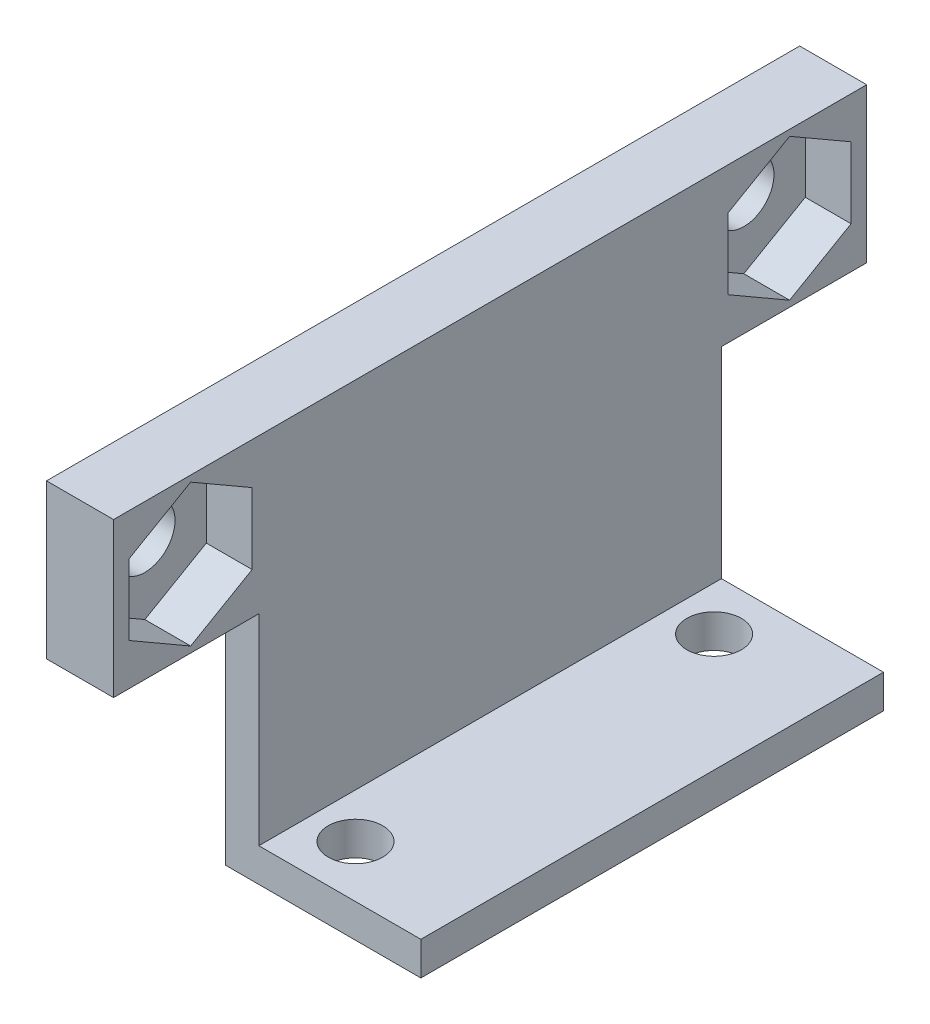
ISO-10303-21;
HEADER;
FILE_DESCRIPTION(('STEP AP214'),'2;1');
FILE_NAME('part.step','',(''),(''),'','','');
FILE_SCHEMA(('AUTOMOTIVE_DESIGN { 1 0 10303 214 1 1 1 1 }'));
ENDSEC;
DATA;
#1=APPLICATION_CONTEXT('core data for automotive mechanical design processes');
#2=APPLICATION_PROTOCOL_DEFINITION('international standard','automotive_design',2000,#1);
#3=PRODUCT_CONTEXT('',#1,'mechanical');
#4=PRODUCT('Part','Part','',(#3));
#5=PRODUCT_RELATED_PRODUCT_CATEGORY('part','',(#4));
#6=PRODUCT_DEFINITION_FORMATION('','',#4);
#7=PRODUCT_DEFINITION_CONTEXT('part definition',#1,'design');
#8=PRODUCT_DEFINITION('design','',#6,#7);
#9=PRODUCT_DEFINITION_SHAPE('','',#8);
#10=(LENGTH_UNIT() NAMED_UNIT(*) SI_UNIT(.MILLI.,.METRE.));
#11=(NAMED_UNIT(*) PLANE_ANGLE_UNIT() SI_UNIT($,.RADIAN.));
#12=(NAMED_UNIT(*) SI_UNIT($,.STERADIAN.) SOLID_ANGLE_UNIT());
#13=UNCERTAINTY_MEASURE_WITH_UNIT(LENGTH_MEASURE(1.E-05),#10,'distance_accuracy_value','');
#14=(GEOMETRIC_REPRESENTATION_CONTEXT(3) GLOBAL_UNCERTAINTY_ASSIGNED_CONTEXT((#13)) GLOBAL_UNIT_ASSIGNED_CONTEXT((#10,
#11,#12)) REPRESENTATION_CONTEXT('',''));
#15=CARTESIAN_POINT('',(0.,0.,0.));
#16=DIRECTION('',(0.,0.,1.));
#17=DIRECTION('',(1.,0.,0.));
#18=AXIS2_PLACEMENT_3D('',#15,#16,#17);
#19=CARTESIAN_POINT('',(0.,0.,0.));
#20=DIRECTION('',(1.,0.,0.));
#21=DIRECTION('',(0.,0.,-1.));
#22=AXIS2_PLACEMENT_3D('',#19,#20,#21);
#23=PLANE('',#22);
#24=DIRECTION('',(0.,-0.5,-0.866025403784439));
#25=VECTOR('',#24,1.);
#26=CARTESIAN_POINT('',(0.,17.1156254174884,3.05));
#27=LINE('',#26,#25);
#28=CARTESIAN_POINT('',(0.,17.1156254174884,3.05));
#29=VERTEX_POINT('',#28);
#30=CARTESIAN_POINT('',(0.,15.5279121772169,0.299999999999996));
#31=VERTEX_POINT('',#30);
#32=EDGE_CURVE('E284',#29,#31,#27,.T.);
#33=ORIENTED_EDGE('',*,*,#32,.T.);
#34=DIRECTION('',(0.,-1.,0.));
#35=VECTOR('',#34,1.);
#36=CARTESIAN_POINT('',(0.,15.5279121772169,0.299999999999996));
#37=LINE('',#36,#35);
#38=CARTESIAN_POINT('',(0.,12.352485696674,0.299999999999996));
#39=VERTEX_POINT('',#38);
#40=EDGE_CURVE('E67',#31,#39,#37,.T.);
#41=ORIENTED_EDGE('',*,*,#40,.T.);
#42=DIRECTION('',(0.,-0.5,0.866025403784438));
#43=VECTOR('',#42,1.);
#44=CARTESIAN_POINT('',(0.,12.352485696674,0.299999999999996));
#45=LINE('',#44,#43);
#46=CARTESIAN_POINT('',(0.,10.7647724564025,3.05));
#47=VERTEX_POINT('',#46);
#48=EDGE_CURVE('E268',#39,#47,#45,.T.);
#49=ORIENTED_EDGE('',*,*,#48,.T.);
#50=DIRECTION('',(0.,0.5,0.866025403784439));
#51=VECTOR('',#50,1.);
#52=CARTESIAN_POINT('',(0.,10.7647724564025,3.05));
#53=LINE('',#52,#51);
#54=CARTESIAN_POINT('',(0.,12.352485696674,5.8));
#55=VERTEX_POINT('',#54);
#56=EDGE_CURVE('E272',#47,#55,#53,.T.);
#57=ORIENTED_EDGE('',*,*,#56,.T.);
#58=DIRECTION('',(0.,1.,0.));
#59=VECTOR('',#58,1.);
#60=CARTESIAN_POINT('',(0.,12.352485696674,5.8));
#61=LINE('',#60,#59);
#62=CARTESIAN_POINT('',(0.,15.5279121772169,5.8));
#63=VERTEX_POINT('',#62);
#64=EDGE_CURVE('E276',#55,#63,#61,.T.);
#65=ORIENTED_EDGE('',*,*,#64,.T.);
#66=DIRECTION('',(0.,0.5,-0.866025403784438));
#67=VECTOR('',#66,1.);
#68=CARTESIAN_POINT('',(0.,15.5279121772169,5.8));
#69=LINE('',#68,#67);
#70=EDGE_CURVE('E280',#63,#29,#69,.T.);
#71=ORIENTED_EDGE('',*,*,#70,.T.);
#72=EDGE_LOOP('',(#33,#41,#49,#57,#65,#71));
#73=FACE_BOUND('',#72,.T.);
#74=DIRECTION('',(0.,0.,-1.));
#75=VECTOR('',#74,1.);
#76=CARTESIAN_POINT('',(0.,10.4901989369455,6.5));
#77=LINE('',#76,#75);
#78=CARTESIAN_POINT('',(0.,10.4901989369455,6.5));
#79=VERTEX_POINT('',#78);
#80=CARTESIAN_POINT('',(0.,10.4901989369455,0.));
#81=VERTEX_POINT('',#80);
#82=EDGE_CURVE('E352',#79,#81,#77,.T.);
#83=ORIENTED_EDGE('',*,*,#82,.T.);
#84=DIRECTION('',(0.,1.,0.));
#85=VECTOR('',#84,1.);
#86=CARTESIAN_POINT('',(0.,0.,0.));
#87=LINE('',#86,#85);
#88=CARTESIAN_POINT('',(0.,1.5,0.));
#89=VERTEX_POINT('',#88);
#90=EDGE_CURVE('E386',#89,#81,#87,.T.);
#91=ORIENTED_EDGE('',*,*,#90,.F.);
#92=DIRECTION('',(0.,0.,1.));
#93=VECTOR('',#92,1.);
#94=CARTESIAN_POINT('',(0.,1.5,0.));
#95=LINE('',#94,#93);
#96=CARTESIAN_POINT('',(0.,1.5,-20.7));
#97=VERTEX_POINT('',#96);
#98=EDGE_CURVE('E427',#97,#89,#95,.T.);
#99=ORIENTED_EDGE('',*,*,#98,.F.);
#100=DIRECTION('',(0.,-1.,0.));
#101=VECTOR('',#100,1.);
#102=CARTESIAN_POINT('',(0.,0.,-20.7));
#103=LINE('',#102,#101);
#104=CARTESIAN_POINT('',(0.,10.4901989369455,-20.7));
#105=VERTEX_POINT('',#104);
#106=EDGE_CURVE('E381',#105,#97,#103,.T.);
#107=ORIENTED_EDGE('',*,*,#106,.F.);
#108=CARTESIAN_POINT('',(0.,10.4901989369455,-27.2));
#109=VERTEX_POINT('',#108);
#110=EDGE_CURVE('E351',#105,#109,#77,.T.);
#111=ORIENTED_EDGE('',*,*,#110,.T.);
#112=DIRECTION('',(0.,1.,0.));
#113=VECTOR('',#112,1.);
#114=CARTESIAN_POINT('',(0.,17.3901989369455,-27.2));
#115=LINE('',#114,#113);
#116=CARTESIAN_POINT('',(0.,17.3901989369455,-27.2));
#117=VERTEX_POINT('',#116);
#118=EDGE_CURVE('E356',#109,#117,#115,.T.);
#119=ORIENTED_EDGE('',*,*,#118,.T.);
#120=DIRECTION('',(0.,0.,1.));
#121=VECTOR('',#120,1.);
#122=CARTESIAN_POINT('',(0.,17.3901989369455,6.5));
#123=LINE('',#122,#121);
#124=CARTESIAN_POINT('',(0.,17.3901989369455,6.5));
#125=VERTEX_POINT('',#124);
#126=EDGE_CURVE('E335',#117,#125,#123,.T.);
#127=ORIENTED_EDGE('',*,*,#126,.T.);
#128=DIRECTION('',(0.,-1.,0.));
#129=VECTOR('',#128,1.);
#130=CARTESIAN_POINT('',(0.,17.3901989369455,6.5));
#131=LINE('',#130,#129);
#132=EDGE_CURVE('E329',#125,#79,#131,.T.);
#133=ORIENTED_EDGE('',*,*,#132,.T.);
#134=EDGE_LOOP('',(#83,#91,#99,#107,#111,#119,#127,#133));
#135=FACE_BOUND('',#134,.T.);
#136=DIRECTION('',(0.,-0.5,-0.866025403784439));
#137=VECTOR('',#136,1.);
#138=CARTESIAN_POINT('',(0.,17.1156254174884,-23.75));
#139=LINE('',#138,#137);
#140=CARTESIAN_POINT('',(0.,17.1156254174884,-23.75));
#141=VERTEX_POINT('',#140);
#142=CARTESIAN_POINT('',(0.,15.5279121772169,-26.5));
#143=VERTEX_POINT('',#142);
#144=EDGE_CURVE('E216',#141,#143,#139,.T.);
#145=ORIENTED_EDGE('',*,*,#144,.T.);
#146=DIRECTION('',(0.,-1.,0.));
#147=VECTOR('',#146,1.);
#148=CARTESIAN_POINT('',(0.,15.5279121772169,-26.5));
#149=LINE('',#148,#147);
#150=CARTESIAN_POINT('',(0.,12.352485696674,-26.5));
#151=VERTEX_POINT('',#150);
#152=EDGE_CURVE('E59',#143,#151,#149,.T.);
#153=ORIENTED_EDGE('',*,*,#152,.T.);
#154=DIRECTION('',(0.,-0.5,0.866025403784439));
#155=VECTOR('',#154,1.);
#156=CARTESIAN_POINT('',(0.,12.352485696674,-26.5));
#157=LINE('',#156,#155);
#158=CARTESIAN_POINT('',(0.,10.7647724564025,-23.75));
#159=VERTEX_POINT('',#158);
#160=EDGE_CURVE('E204',#151,#159,#157,.T.);
#161=ORIENTED_EDGE('',*,*,#160,.T.);
#162=DIRECTION('',(0.,0.499999999999999,0.866025403784439));
#163=VECTOR('',#162,1.);
#164=CARTESIAN_POINT('',(0.,10.7647724564025,-23.75));
#165=LINE('',#164,#163);
#166=CARTESIAN_POINT('',(0.,12.352485696674,-21.));
#167=VERTEX_POINT('',#166);
#168=EDGE_CURVE('E211',#159,#167,#165,.T.);
#169=ORIENTED_EDGE('',*,*,#168,.T.);
#170=DIRECTION('',(0.,1.,0.));
#171=VECTOR('',#170,1.);
#172=CARTESIAN_POINT('',(0.,12.352485696674,-21.));
#173=LINE('',#172,#171);
#174=CARTESIAN_POINT('',(0.,15.5279121772169,-21.));
#175=VERTEX_POINT('',#174);
#176=EDGE_CURVE('E226',#167,#175,#173,.T.);
#177=ORIENTED_EDGE('',*,*,#176,.T.);
#178=DIRECTION('',(0.,0.5,-0.866025403784439));
#179=VECTOR('',#178,1.);
#180=CARTESIAN_POINT('',(0.,15.5279121772169,-21.));
#181=LINE('',#180,#179);
#182=EDGE_CURVE('E230',#175,#141,#181,.T.);
#183=ORIENTED_EDGE('',*,*,#182,.T.);
#184=EDGE_LOOP('',(#145,#153,#161,#169,#177,#183));
#185=FACE_BOUND('',#184,.T.);
#186=ADVANCED_FACE('F41',(#73,#135,#185),#23,.T.);
#187=CARTESIAN_POINT('',(0.,1.5,0.));
#188=DIRECTION('',(0.,-1.,0.));
#189=DIRECTION('',(0.,0.,-1.));
#190=AXIS2_PLACEMENT_3D('',#187,#188,#189);
#191=PLANE('',#190);
#192=CARTESIAN_POINT('',(1.98209141099559,1.5,-18.388490579853));
#193=DIRECTION('',(0.,1.,0.));
#194=DIRECTION('',(0.,0.,1.));
#195=AXIS2_PLACEMENT_3D('',#192,#193,#194);
#196=CIRCLE('',#195,1.22);
#197=CARTESIAN_POINT('',(1.98209141099559,1.5,-17.168490579853));
#198=VERTEX_POINT('',#197);
#199=EDGE_CURVE('E411',#198,#198,#196,.T.);
#200=ORIENTED_EDGE('',*,*,#199,.F.);
#201=EDGE_LOOP('',(#200));
#202=FACE_BOUND('',#201,.T.);
#203=CARTESIAN_POINT('',(1.99649482415193,1.5,-2.3283066399969));
#204=DIRECTION('',(0.,1.,0.));
#205=DIRECTION('',(0.,0.,1.));
#206=AXIS2_PLACEMENT_3D('',#203,#204,#205);
#207=CIRCLE('',#206,1.22);
#208=CARTESIAN_POINT('',(1.99649482415193,1.5,-1.1083066399969));
#209=VERTEX_POINT('',#208);
#210=EDGE_CURVE('E419',#209,#209,#207,.T.);
#211=ORIENTED_EDGE('',*,*,#210,.F.);
#212=EDGE_LOOP('',(#211));
#213=FACE_BOUND('',#212,.T.);
#214=DIRECTION('',(0.,0.,1.));
#215=VECTOR('',#214,1.);
#216=CARTESIAN_POINT('',(7.25,1.5,0.));
#217=LINE('',#216,#215);
#218=CARTESIAN_POINT('',(7.25,1.5,-20.7));
#219=VERTEX_POINT('',#218);
#220=CARTESIAN_POINT('',(7.25,1.5,0.));
#221=VERTEX_POINT('',#220);
#222=EDGE_CURVE('E407',#219,#221,#217,.T.);
#223=ORIENTED_EDGE('',*,*,#222,.F.);
#224=DIRECTION('',(-1.,0.,0.));
#225=VECTOR('',#224,1.);
#226=CARTESIAN_POINT('',(0.,1.5,-20.7));
#227=LINE('',#226,#225);
#228=EDGE_CURVE('E51',#219,#97,#227,.T.);
#229=ORIENTED_EDGE('',*,*,#228,.T.);
#230=ORIENTED_EDGE('',*,*,#98,.T.);
#231=DIRECTION('',(1.,0.,0.));
#232=VECTOR('',#231,1.);
#233=CARTESIAN_POINT('',(0.,1.5,0.));
#234=LINE('',#233,#232);
#235=EDGE_CURVE('E431',#89,#221,#234,.T.);
#236=ORIENTED_EDGE('',*,*,#235,.T.);
#237=EDGE_LOOP('',(#223,#229,#230,#236));
#238=FACE_BOUND('',#237,.T.);
#239=ADVANCED_FACE('F470',(#202,#213,#238),#191,.F.);
#240=CARTESIAN_POINT('',(0.,0.,0.));
#241=DIRECTION('',(0.,-1.,0.));
#242=DIRECTION('',(0.,0.,-1.));
#243=AXIS2_PLACEMENT_3D('',#240,#241,#242);
#244=PLANE('',#243);
#245=CARTESIAN_POINT('',(1.99649482415193,0.,-2.3283066399969));
#246=DIRECTION('',(0.,1.,0.));
#247=DIRECTION('',(0.,0.,1.));
#248=AXIS2_PLACEMENT_3D('',#245,#246,#247);
#249=CIRCLE('',#248,1.22);
#250=CARTESIAN_POINT('',(1.99649482415193,0.,-1.1083066399969));
#251=VERTEX_POINT('',#250);
#252=EDGE_CURVE('E415',#251,#251,#249,.T.);
#253=ORIENTED_EDGE('',*,*,#252,.T.);
#254=EDGE_LOOP('',(#253));
#255=FACE_BOUND('',#254,.T.);
#256=CARTESIAN_POINT('',(1.98209141099559,0.,-18.388490579853));
#257=DIRECTION('',(0.,1.,0.));
#258=DIRECTION('',(0.,0.,1.));
#259=AXIS2_PLACEMENT_3D('',#256,#257,#258);
#260=CIRCLE('',#259,1.22);
#261=CARTESIAN_POINT('',(1.98209141099559,0.,-17.168490579853));
#262=VERTEX_POINT('',#261);
#263=EDGE_CURVE('E410',#262,#262,#260,.T.);
#264=ORIENTED_EDGE('',*,*,#263,.T.);
#265=EDGE_LOOP('',(#264));
#266=FACE_BOUND('',#265,.T.);
#267=DIRECTION('',(-1.,0.,0.));
#268=VECTOR('',#267,1.);
#269=CARTESIAN_POINT('',(0.,0.,-20.7));
#270=LINE('',#269,#268);
#271=CARTESIAN_POINT('',(7.25,0.,-20.7));
#272=VERTEX_POINT('',#271);
#273=CARTESIAN_POINT('',(-1.5,0.,-20.7));
#274=VERTEX_POINT('',#273);
#275=EDGE_CURVE('E432',#272,#274,#270,.T.);
#276=ORIENTED_EDGE('',*,*,#275,.F.);
#277=DIRECTION('',(0.,0.,-1.));
#278=VECTOR('',#277,1.);
#279=CARTESIAN_POINT('',(7.25,0.,0.));
#280=LINE('',#279,#278);
#281=CARTESIAN_POINT('',(7.25,0.,0.));
#282=VERTEX_POINT('',#281);
#283=EDGE_CURVE('E401',#282,#272,#280,.T.);
#284=ORIENTED_EDGE('',*,*,#283,.F.);
#285=DIRECTION('',(1.,0.,0.));
#286=VECTOR('',#285,1.);
#287=CARTESIAN_POINT('',(0.,0.,0.));
#288=LINE('',#287,#286);
#289=CARTESIAN_POINT('',(-1.5,0.,0.));
#290=VERTEX_POINT('',#289);
#291=EDGE_CURVE('E423',#290,#282,#288,.T.);
#292=ORIENTED_EDGE('',*,*,#291,.F.);
#293=DIRECTION('',(0.,0.,1.));
#294=VECTOR('',#293,1.);
#295=CARTESIAN_POINT('',(-1.5,0.,-20.7));
#296=LINE('',#295,#294);
#297=EDGE_CURVE('E385',#274,#290,#296,.T.);
#298=ORIENTED_EDGE('',*,*,#297,.F.);
#299=EDGE_LOOP('',(#276,#284,#292,#298));
#300=FACE_BOUND('',#299,.T.);
#301=ADVANCED_FACE('F476',(#255,#266,#300),#244,.T.);
#302=CARTESIAN_POINT('',(0.,1.5,0.));
#303=DIRECTION('',(0.,0.,-1.));
#304=DIRECTION('',(-1.,0.,0.));
#305=AXIS2_PLACEMENT_3D('',#302,#303,#304);
#306=PLANE('',#305);
#307=ORIENTED_EDGE('',*,*,#90,.T.);
#308=DIRECTION('',(-1.,0.,0.));
#309=VECTOR('',#308,1.);
#310=CARTESIAN_POINT('',(0.,10.4901989369455,0.));
#311=LINE('',#310,#309);
#312=CARTESIAN_POINT('',(-1.5,10.4901989369455,0.));
#313=VERTEX_POINT('',#312);
#314=EDGE_CURVE('E378',#81,#313,#311,.T.);
#315=ORIENTED_EDGE('',*,*,#314,.T.);
#316=DIRECTION('',(0.,1.,0.));
#317=VECTOR('',#316,1.);
#318=CARTESIAN_POINT('',(-1.5,0.,0.));
#319=LINE('',#318,#317);
#320=EDGE_CURVE('E390',#290,#313,#319,.T.);
#321=ORIENTED_EDGE('',*,*,#320,.F.);
#322=ORIENTED_EDGE('',*,*,#291,.T.);
#323=DIRECTION('',(0.,-1.,0.));
#324=VECTOR('',#323,1.);
#325=CARTESIAN_POINT('',(7.25,0.,0.));
#326=LINE('',#325,#324);
#327=EDGE_CURVE('E394',#221,#282,#326,.T.);
#328=ORIENTED_EDGE('',*,*,#327,.F.);
#329=ORIENTED_EDGE('',*,*,#235,.F.);
#330=EDGE_LOOP('',(#307,#315,#321,#322,#328,#329));
#331=FACE_BOUND('',#330,.T.);
#332=ADVANCED_FACE('F43',(#331),#306,.F.);
#333=CARTESIAN_POINT('',(0.,1.5,-20.7));
#334=DIRECTION('',(0.,0.,1.));
#335=DIRECTION('',(1.,0.,0.));
#336=AXIS2_PLACEMENT_3D('',#333,#334,#335);
#337=PLANE('',#336);
#338=DIRECTION('',(0.,-1.,0.));
#339=VECTOR('',#338,1.);
#340=CARTESIAN_POINT('',(-1.5,0.,-20.7));
#341=LINE('',#340,#339);
#342=CARTESIAN_POINT('',(-1.5,10.4901989369455,-20.7));
#343=VERTEX_POINT('',#342);
#344=EDGE_CURVE('E382',#343,#274,#341,.T.);
#345=ORIENTED_EDGE('',*,*,#344,.F.);
#346=DIRECTION('',(1.,0.,0.));
#347=VECTOR('',#346,1.);
#348=CARTESIAN_POINT('',(0.,10.4901989369455,-20.7));
#349=LINE('',#348,#347);
#350=EDGE_CURVE('E366',#343,#105,#349,.T.);
#351=ORIENTED_EDGE('',*,*,#350,.T.);
#352=ORIENTED_EDGE('',*,*,#106,.T.);
#353=ORIENTED_EDGE('',*,*,#228,.F.);
#354=DIRECTION('',(0.,1.,0.));
#355=VECTOR('',#354,1.);
#356=CARTESIAN_POINT('',(7.25,0.,-20.7));
#357=LINE('',#356,#355);
#358=EDGE_CURVE('E404',#272,#219,#357,.T.);
#359=ORIENTED_EDGE('',*,*,#358,.F.);
#360=ORIENTED_EDGE('',*,*,#275,.T.);
#361=EDGE_LOOP('',(#345,#351,#352,#353,#359,#360));
#362=FACE_BOUND('',#361,.T.);
#363=ADVANCED_FACE('F494',(#362),#337,.F.);
#364=CARTESIAN_POINT('',(1.99649482415193,1.5,-2.3283066399969));
#365=DIRECTION('',(0.,-1.,0.));
#366=DIRECTION('',(0.,0.,-1.));
#367=AXIS2_PLACEMENT_3D('',#364,#365,#366);
#368=CYLINDRICAL_SURFACE('',#367,1.22);
#369=ORIENTED_EDGE('',*,*,#210,.T.);
#370=EDGE_LOOP('',(#369));
#371=FACE_BOUND('',#370,.T.);
#372=ORIENTED_EDGE('',*,*,#252,.F.);
#373=EDGE_LOOP('',(#372));
#374=FACE_BOUND('',#373,.T.);
#375=ADVANCED_FACE('F491',(#371,#374),#368,.F.);
#376=CARTESIAN_POINT('',(1.98209141099559,1.5,-18.388490579853));
#377=DIRECTION('',(0.,-1.,0.));
#378=DIRECTION('',(0.,0.,-1.));
#379=AXIS2_PLACEMENT_3D('',#376,#377,#378);
#380=CYLINDRICAL_SURFACE('',#379,1.22);
#381=ORIENTED_EDGE('',*,*,#199,.T.);
#382=EDGE_LOOP('',(#381));
#383=FACE_BOUND('',#382,.T.);
#384=ORIENTED_EDGE('',*,*,#263,.F.);
#385=EDGE_LOOP('',(#384));
#386=FACE_BOUND('',#385,.T.);
#387=ADVANCED_FACE('F487',(#383,#386),#380,.F.);
#388=CARTESIAN_POINT('',(7.25,0.,0.));
#389=DIRECTION('',(1.,0.,0.));
#390=DIRECTION('',(0.,0.,-1.));
#391=AXIS2_PLACEMENT_3D('',#388,#389,#390);
#392=PLANE('',#391);
#393=ORIENTED_EDGE('',*,*,#327,.T.);
#394=ORIENTED_EDGE('',*,*,#283,.T.);
#395=ORIENTED_EDGE('',*,*,#358,.T.);
#396=ORIENTED_EDGE('',*,*,#222,.T.);
#397=EDGE_LOOP('',(#393,#394,#395,#396));
#398=FACE_BOUND('',#397,.T.);
#399=ADVANCED_FACE('F484',(#398),#392,.T.);
#400=CARTESIAN_POINT('',(-1.5,0.,0.));
#401=DIRECTION('',(1.,0.,0.));
#402=DIRECTION('',(0.,0.,-1.));
#403=AXIS2_PLACEMENT_3D('',#400,#401,#402);
#404=PLANE('',#403);
#405=ORIENTED_EDGE('',*,*,#320,.T.);
#406=DIRECTION('',(0.,0.,-1.));
#407=VECTOR('',#406,1.);
#408=CARTESIAN_POINT('',(-1.5,10.4901989369455,0.));
#409=LINE('',#408,#407);
#410=EDGE_CURVE('E11',#313,#343,#409,.T.);
#411=ORIENTED_EDGE('',*,*,#410,.T.);
#412=ORIENTED_EDGE('',*,*,#344,.T.);
#413=ORIENTED_EDGE('',*,*,#297,.T.);
#414=EDGE_LOOP('',(#405,#411,#412,#413));
#415=FACE_BOUND('',#414,.T.);
#416=ADVANCED_FACE('F482',(#415),#404,.F.);
#417=CARTESIAN_POINT('',(-3.,10.4901989369455,6.5));
#418=DIRECTION('',(0.,-1.,0.));
#419=DIRECTION('',(0.,0.,-1.));
#420=AXIS2_PLACEMENT_3D('',#417,#418,#419);
#421=PLANE('',#420);
#422=ORIENTED_EDGE('',*,*,#314,.F.);
#423=ORIENTED_EDGE('',*,*,#82,.F.);
#424=DIRECTION('',(1.,0.,0.));
#425=VECTOR('',#424,1.);
#426=CARTESIAN_POINT('',(-3.,10.4901989369455,6.5));
#427=LINE('',#426,#425);
#428=CARTESIAN_POINT('',(-3.,10.4901989369455,6.5));
#429=VERTEX_POINT('',#428);
#430=EDGE_CURVE('E347',#429,#79,#427,.T.);
#431=ORIENTED_EDGE('',*,*,#430,.F.);
#432=DIRECTION('',(0.,0.,-1.));
#433=VECTOR('',#432,1.);
#434=CARTESIAN_POINT('',(-3.,10.4901989369455,6.5));
#435=LINE('',#434,#433);
#436=CARTESIAN_POINT('',(-3.,10.4901989369455,-27.2));
#437=VERTEX_POINT('',#436);
#438=EDGE_CURVE('E334',#429,#437,#435,.T.);
#439=ORIENTED_EDGE('',*,*,#438,.T.);
#440=DIRECTION('',(1.,0.,0.));
#441=VECTOR('',#440,1.);
#442=CARTESIAN_POINT('',(-3.,10.4901989369455,-27.2));
#443=LINE('',#442,#441);
#444=EDGE_CURVE('E370',#437,#109,#443,.T.);
#445=ORIENTED_EDGE('',*,*,#444,.T.);
#446=ORIENTED_EDGE('',*,*,#110,.F.);
#447=ORIENTED_EDGE('',*,*,#350,.F.);
#448=ORIENTED_EDGE('',*,*,#410,.F.);
#449=EDGE_LOOP('',(#422,#423,#431,#439,#445,#446,#447,#448));
#450=FACE_BOUND('',#449,.T.);
#451=ADVANCED_FACE('F516',(#450),#421,.T.);
#452=CARTESIAN_POINT('',(-3.,17.3901989369455,6.5));
#453=DIRECTION('',(0.,0.,1.));
#454=DIRECTION('',(1.,0.,0.));
#455=AXIS2_PLACEMENT_3D('',#452,#453,#454);
#456=PLANE('',#455);
#457=ORIENTED_EDGE('',*,*,#132,.F.);
#458=DIRECTION('',(1.,0.,0.));
#459=VECTOR('',#458,1.);
#460=CARTESIAN_POINT('',(-3.,17.3901989369455,6.5));
#461=LINE('',#460,#459);
#462=CARTESIAN_POINT('',(-3.,17.3901989369455,6.5));
#463=VERTEX_POINT('',#462);
#464=EDGE_CURVE('E363',#463,#125,#461,.T.);
#465=ORIENTED_EDGE('',*,*,#464,.F.);
#466=DIRECTION('',(0.,-1.,0.));
#467=VECTOR('',#466,1.);
#468=CARTESIAN_POINT('',(-3.,17.3901989369455,6.5));
#469=LINE('',#468,#467);
#470=EDGE_CURVE('E330',#463,#429,#469,.T.);
#471=ORIENTED_EDGE('',*,*,#470,.T.);
#472=ORIENTED_EDGE('',*,*,#430,.T.);
#473=EDGE_LOOP('',(#457,#465,#471,#472));
#474=FACE_BOUND('',#473,.T.);
#475=ADVANCED_FACE('F533',(#474),#456,.T.);
#476=CARTESIAN_POINT('',(-3.,17.3901989369455,6.5));
#477=DIRECTION('',(0.,1.,0.));
#478=DIRECTION('',(0.,0.,1.));
#479=AXIS2_PLACEMENT_3D('',#476,#477,#478);
#480=PLANE('',#479);
#481=ORIENTED_EDGE('',*,*,#126,.F.);
#482=DIRECTION('',(1.,0.,0.));
#483=VECTOR('',#482,1.);
#484=CARTESIAN_POINT('',(-3.,17.3901989369455,-27.2));
#485=LINE('',#484,#483);
#486=CARTESIAN_POINT('',(-3.,17.3901989369455,-27.2));
#487=VERTEX_POINT('',#486);
#488=EDGE_CURVE('E367',#487,#117,#485,.T.);
#489=ORIENTED_EDGE('',*,*,#488,.F.);
#490=DIRECTION('',(0.,0.,1.));
#491=VECTOR('',#490,1.);
#492=CARTESIAN_POINT('',(-3.,17.3901989369455,6.5));
#493=LINE('',#492,#491);
#494=EDGE_CURVE('E343',#487,#463,#493,.T.);
#495=ORIENTED_EDGE('',*,*,#494,.T.);
#496=ORIENTED_EDGE('',*,*,#464,.T.);
#497=EDGE_LOOP('',(#481,#489,#495,#496));
#498=FACE_BOUND('',#497,.T.);
#499=ADVANCED_FACE('F538',(#498),#480,.T.);
#500=CARTESIAN_POINT('',(-3.,17.3901989369455,-27.2));
#501=DIRECTION('',(0.,0.,-1.));
#502=DIRECTION('',(-1.,0.,0.));
#503=AXIS2_PLACEMENT_3D('',#500,#501,#502);
#504=PLANE('',#503);
#505=ORIENTED_EDGE('',*,*,#118,.F.);
#506=ORIENTED_EDGE('',*,*,#444,.F.);
#507=DIRECTION('',(0.,1.,0.));
#508=VECTOR('',#507,1.);
#509=CARTESIAN_POINT('',(-3.,17.3901989369455,-27.2));
#510=LINE('',#509,#508);
#511=EDGE_CURVE('E339',#437,#487,#510,.T.);
#512=ORIENTED_EDGE('',*,*,#511,.T.);
#513=ORIENTED_EDGE('',*,*,#488,.T.);
#514=EDGE_LOOP('',(#505,#506,#512,#513));
#515=FACE_BOUND('',#514,.T.);
#516=ADVANCED_FACE('F541',(#515),#504,.T.);
#517=CARTESIAN_POINT('',(-3.,0.,0.));
#518=DIRECTION('',(1.,0.,0.));
#519=DIRECTION('',(0.,0.,-1.));
#520=AXIS2_PLACEMENT_3D('',#517,#518,#519);
#521=PLANE('',#520);
#522=CARTESIAN_POINT('',(-3.,13.9401989369455,3.05));
#523=DIRECTION('',(1.,0.,0.));
#524=DIRECTION('',(0.,0.,-1.));
#525=AXIS2_PLACEMENT_3D('',#522,#523,#524);
#526=CIRCLE('',#525,1.35);
#527=CARTESIAN_POINT('',(-3.,13.9401989369455,1.7));
#528=VERTEX_POINT('',#527);
#529=EDGE_CURVE('E321',#528,#528,#526,.T.);
#530=ORIENTED_EDGE('',*,*,#529,.T.);
#531=EDGE_LOOP('',(#530));
#532=FACE_BOUND('',#531,.T.);
#533=CARTESIAN_POINT('',(-3.,13.9401989369455,-23.75));
#534=DIRECTION('',(1.,0.,0.));
#535=DIRECTION('',(0.,0.,-1.));
#536=AXIS2_PLACEMENT_3D('',#533,#534,#535);
#537=CIRCLE('',#536,1.35);
#538=CARTESIAN_POINT('',(-3.,13.9401989369455,-25.1));
#539=VERTEX_POINT('',#538);
#540=EDGE_CURVE('E325',#539,#539,#537,.T.);
#541=ORIENTED_EDGE('',*,*,#540,.T.);
#542=EDGE_LOOP('',(#541));
#543=FACE_BOUND('',#542,.T.);
#544=ORIENTED_EDGE('',*,*,#470,.F.);
#545=ORIENTED_EDGE('',*,*,#494,.F.);
#546=ORIENTED_EDGE('',*,*,#511,.F.);
#547=ORIENTED_EDGE('',*,*,#438,.F.);
#548=EDGE_LOOP('',(#544,#545,#546,#547));
#549=FACE_BOUND('',#548,.T.);
#550=ADVANCED_FACE('F544',(#532,#543,#549),#521,.F.);
#551=CARTESIAN_POINT('',(-3.,13.9401989369455,-23.75));
#552=DIRECTION('',(1.,0.,0.));
#553=DIRECTION('',(0.,0.,-1.));
#554=AXIS2_PLACEMENT_3D('',#551,#552,#553);
#555=CYLINDRICAL_SURFACE('',#554,1.35);
#556=CARTESIAN_POINT('',(-2.05,13.9401989369455,-23.75));
#557=DIRECTION('',(-1.,0.,0.));
#558=DIRECTION('',(0.,0.,1.));
#559=AXIS2_PLACEMENT_3D('',#556,#557,#558);
#560=CIRCLE('',#559,1.35);
#561=CARTESIAN_POINT('',(-2.05,13.9401989369455,-22.4));
#562=VERTEX_POINT('',#561);
#563=EDGE_CURVE('E45',#562,#562,#560,.F.);
#564=ORIENTED_EDGE('',*,*,#563,.T.);
#565=EDGE_LOOP('',(#564));
#566=FACE_BOUND('',#565,.T.);
#567=ORIENTED_EDGE('',*,*,#540,.F.);
#568=EDGE_LOOP('',(#567));
#569=FACE_BOUND('',#568,.T.);
#570=ADVANCED_FACE('F452',(#566,#569),#555,.F.);
#571=CARTESIAN_POINT('',(-3.,13.9401989369455,3.05));
#572=DIRECTION('',(1.,0.,0.));
#573=DIRECTION('',(0.,0.,-1.));
#574=AXIS2_PLACEMENT_3D('',#571,#572,#573);
#575=CYLINDRICAL_SURFACE('',#574,1.35);
#576=CARTESIAN_POINT('',(-2.05,13.9401989369455,3.05));
#577=DIRECTION('',(-1.,0.,0.));
#578=DIRECTION('',(0.,0.,1.));
#579=AXIS2_PLACEMENT_3D('',#576,#577,#578);
#580=CIRCLE('',#579,1.35);
#581=CARTESIAN_POINT('',(-2.05,13.9401989369455,4.4));
#582=VERTEX_POINT('',#581);
#583=EDGE_CURVE('E200',#582,#582,#580,.F.);
#584=ORIENTED_EDGE('',*,*,#583,.T.);
#585=EDGE_LOOP('',(#584));
#586=FACE_BOUND('',#585,.T.);
#587=ORIENTED_EDGE('',*,*,#529,.F.);
#588=EDGE_LOOP('',(#587));
#589=FACE_BOUND('',#588,.T.);
#590=ADVANCED_FACE('F554',(#586,#589),#575,.F.);
#591=CARTESIAN_POINT('',(-2.05,0.,0.));
#592=DIRECTION('',(-1.,0.,0.));
#593=DIRECTION('',(0.,0.,1.));
#594=AXIS2_PLACEMENT_3D('',#591,#592,#593);
#595=PLANE('',#594);
#596=DIRECTION('',(0.,-1.,0.));
#597=VECTOR('',#596,1.);
#598=CARTESIAN_POINT('',(-2.05,15.5279121772169,0.299999999999996));
#599=LINE('',#598,#597);
#600=CARTESIAN_POINT('',(-2.05,15.5279121772169,0.299999999999996));
#601=VERTEX_POINT('',#600);
#602=CARTESIAN_POINT('',(-2.05,12.352485696674,0.299999999999996));
#603=VERTEX_POINT('',#602);
#604=EDGE_CURVE('E288',#601,#603,#599,.T.);
#605=ORIENTED_EDGE('',*,*,#604,.F.);
#606=DIRECTION('',(0.,-0.5,-0.866025403784439));
#607=VECTOR('',#606,1.);
#608=CARTESIAN_POINT('',(-2.05,17.1156254174884,3.05));
#609=LINE('',#608,#607);
#610=CARTESIAN_POINT('',(-2.05,17.1156254174884,3.05));
#611=VERTEX_POINT('',#610);
#612=EDGE_CURVE('E304',#611,#601,#609,.T.);
#613=ORIENTED_EDGE('',*,*,#612,.F.);
#614=DIRECTION('',(0.,0.5,-0.866025403784438));
#615=VECTOR('',#614,1.);
#616=CARTESIAN_POINT('',(-2.05,15.5279121772169,5.8));
#617=LINE('',#616,#615);
#618=CARTESIAN_POINT('',(-2.05,15.5279121772169,5.8));
#619=VERTEX_POINT('',#618);
#620=EDGE_CURVE('E301',#619,#611,#617,.T.);
#621=ORIENTED_EDGE('',*,*,#620,.F.);
#622=DIRECTION('',(0.,1.,0.));
#623=VECTOR('',#622,1.);
#624=CARTESIAN_POINT('',(-2.05,12.352485696674,5.8));
#625=LINE('',#624,#623);
#626=CARTESIAN_POINT('',(-2.05,12.352485696674,5.8));
#627=VERTEX_POINT('',#626);
#628=EDGE_CURVE('E298',#627,#619,#625,.T.);
#629=ORIENTED_EDGE('',*,*,#628,.F.);
#630=DIRECTION('',(0.,0.5,0.866025403784439));
#631=VECTOR('',#630,1.);
#632=CARTESIAN_POINT('',(-2.05,10.7647724564025,3.05));
#633=LINE('',#632,#631);
#634=CARTESIAN_POINT('',(-2.05,10.7647724564025,3.05));
#635=VERTEX_POINT('',#634);
#636=EDGE_CURVE('E295',#635,#627,#633,.T.);
#637=ORIENTED_EDGE('',*,*,#636,.F.);
#638=DIRECTION('',(0.,-0.5,0.866025403784438));
#639=VECTOR('',#638,1.);
#640=CARTESIAN_POINT('',(-2.05,12.352485696674,0.299999999999996));
#641=LINE('',#640,#639);
#642=EDGE_CURVE('E292',#603,#635,#641,.T.);
#643=ORIENTED_EDGE('',*,*,#642,.F.);
#644=EDGE_LOOP('',(#605,#613,#621,#629,#637,#643));
#645=FACE_BOUND('',#644,.T.);
#646=ORIENTED_EDGE('',*,*,#583,.F.);
#647=EDGE_LOOP('',(#646));
#648=FACE_BOUND('',#647,.T.);
#649=ADVANCED_FACE('F557',(#645,#648),#595,.F.);
#650=CARTESIAN_POINT('',(-2.05,15.5279121772169,0.299999999999996));
#651=DIRECTION('',(0.,0.,1.));
#652=DIRECTION('',(1.,0.,0.));
#653=AXIS2_PLACEMENT_3D('',#650,#651,#652);
#654=PLANE('',#653);
#655=DIRECTION('',(1.,0.,0.));
#656=VECTOR('',#655,1.);
#657=CARTESIAN_POINT('',(-2.05,15.5279121772169,0.299999999999996));
#658=LINE('',#657,#656);
#659=EDGE_CURVE('E307',#601,#31,#658,.T.);
#660=ORIENTED_EDGE('',*,*,#659,.F.);
#661=ORIENTED_EDGE('',*,*,#604,.T.);
#662=DIRECTION('',(1.,0.,0.));
#663=VECTOR('',#662,1.);
#664=CARTESIAN_POINT('',(-2.05,12.352485696674,0.299999999999996));
#665=LINE('',#664,#663);
#666=EDGE_CURVE('E218',#603,#39,#665,.T.);
#667=ORIENTED_EDGE('',*,*,#666,.T.);
#668=ORIENTED_EDGE('',*,*,#40,.F.);
#669=EDGE_LOOP('',(#660,#661,#667,#668));
#670=FACE_BOUND('',#669,.T.);
#671=ADVANCED_FACE('F558',(#670),#654,.T.);
#672=CARTESIAN_POINT('',(-2.05,12.352485696674,0.299999999999996));
#673=DIRECTION('',(0.,0.866025403784438,0.5));
#674=DIRECTION('',(0.,-0.5,0.866025403784438));
#675=AXIS2_PLACEMENT_3D('',#672,#673,#674);
#676=PLANE('',#675);
#677=ORIENTED_EDGE('',*,*,#666,.F.);
#678=ORIENTED_EDGE('',*,*,#642,.T.);
#679=DIRECTION('',(1.,0.,0.));
#680=VECTOR('',#679,1.);
#681=CARTESIAN_POINT('',(-2.05,10.7647724564025,3.05));
#682=LINE('',#681,#680);
#683=EDGE_CURVE('E221',#635,#47,#682,.T.);
#684=ORIENTED_EDGE('',*,*,#683,.T.);
#685=ORIENTED_EDGE('',*,*,#48,.F.);
#686=EDGE_LOOP('',(#677,#678,#684,#685));
#687=FACE_BOUND('',#686,.T.);
#688=ADVANCED_FACE('F561',(#687),#676,.T.);
#689=CARTESIAN_POINT('',(-2.05,10.7647724564025,3.05));
#690=DIRECTION('',(0.,0.866025403784439,-0.5));
#691=DIRECTION('',(0.,0.5,0.866025403784439));
#692=AXIS2_PLACEMENT_3D('',#689,#690,#691);
#693=PLANE('',#692);
#694=ORIENTED_EDGE('',*,*,#683,.F.);
#695=ORIENTED_EDGE('',*,*,#636,.T.);
#696=DIRECTION('',(1.,0.,0.));
#697=VECTOR('',#696,1.);
#698=CARTESIAN_POINT('',(-2.05,12.352485696674,5.8));
#699=LINE('',#698,#697);
#700=EDGE_CURVE('E316',#627,#55,#699,.T.);
#701=ORIENTED_EDGE('',*,*,#700,.T.);
#702=ORIENTED_EDGE('',*,*,#56,.F.);
#703=EDGE_LOOP('',(#694,#695,#701,#702));
#704=FACE_BOUND('',#703,.T.);
#705=ADVANCED_FACE('F564',(#704),#693,.T.);
#706=CARTESIAN_POINT('',(-2.05,12.352485696674,5.8));
#707=DIRECTION('',(0.,0.,-1.));
#708=DIRECTION('',(0.,1.,0.));
#709=AXIS2_PLACEMENT_3D('',#706,#707,#708);
#710=PLANE('',#709);
#711=ORIENTED_EDGE('',*,*,#700,.F.);
#712=ORIENTED_EDGE('',*,*,#628,.T.);
#713=DIRECTION('',(1.,0.,0.));
#714=VECTOR('',#713,1.);
#715=CARTESIAN_POINT('',(-2.05,15.5279121772169,5.8));
#716=LINE('',#715,#714);
#717=EDGE_CURVE('E313',#619,#63,#716,.T.);
#718=ORIENTED_EDGE('',*,*,#717,.T.);
#719=ORIENTED_EDGE('',*,*,#64,.F.);
#720=EDGE_LOOP('',(#711,#712,#718,#719));
#721=FACE_BOUND('',#720,.T.);
#722=ADVANCED_FACE('F568',(#721),#710,.T.);
#723=CARTESIAN_POINT('',(-2.05,15.5279121772169,5.8));
#724=DIRECTION('',(0.,-0.866025403784438,-0.5));
#725=DIRECTION('',(0.,0.5,-0.866025403784438));
#726=AXIS2_PLACEMENT_3D('',#723,#724,#725);
#727=PLANE('',#726);
#728=ORIENTED_EDGE('',*,*,#717,.F.);
#729=ORIENTED_EDGE('',*,*,#620,.T.);
#730=DIRECTION('',(1.,0.,0.));
#731=VECTOR('',#730,1.);
#732=CARTESIAN_POINT('',(-2.05,17.1156254174884,3.05));
#733=LINE('',#732,#731);
#734=EDGE_CURVE('E310',#611,#29,#733,.T.);
#735=ORIENTED_EDGE('',*,*,#734,.T.);
#736=ORIENTED_EDGE('',*,*,#70,.F.);
#737=EDGE_LOOP('',(#728,#729,#735,#736));
#738=FACE_BOUND('',#737,.T.);
#739=ADVANCED_FACE('F465',(#738),#727,.T.);
#740=CARTESIAN_POINT('',(-2.05,17.1156254174884,3.05));
#741=DIRECTION('',(0.,-0.866025403784439,0.5));
#742=DIRECTION('',(0.,-0.5,-0.866025403784439));
#743=AXIS2_PLACEMENT_3D('',#740,#741,#742);
#744=PLANE('',#743);
#745=ORIENTED_EDGE('',*,*,#734,.F.);
#746=ORIENTED_EDGE('',*,*,#612,.T.);
#747=ORIENTED_EDGE('',*,*,#659,.T.);
#748=ORIENTED_EDGE('',*,*,#32,.F.);
#749=EDGE_LOOP('',(#745,#746,#747,#748));
#750=FACE_BOUND('',#749,.T.);
#751=ADVANCED_FACE('F457',(#750),#744,.T.);
#752=CARTESIAN_POINT('',(-2.05,0.,0.));
#753=DIRECTION('',(-1.,0.,0.));
#754=DIRECTION('',(0.,0.,1.));
#755=AXIS2_PLACEMENT_3D('',#752,#753,#754);
#756=PLANE('',#755);
#757=DIRECTION('',(0.,-1.,0.));
#758=VECTOR('',#757,1.);
#759=CARTESIAN_POINT('',(-2.05,15.5279121772169,-26.5));
#760=LINE('',#759,#758);
#761=CARTESIAN_POINT('',(-2.05,15.5279121772169,-26.5));
#762=VERTEX_POINT('',#761);
#763=CARTESIAN_POINT('',(-2.05,12.352485696674,-26.5));
#764=VERTEX_POINT('',#763);
#765=EDGE_CURVE('E197',#762,#764,#760,.T.);
#766=ORIENTED_EDGE('',*,*,#765,.F.);
#767=DIRECTION('',(0.,-0.5,-0.866025403784439));
#768=VECTOR('',#767,1.);
#769=CARTESIAN_POINT('',(-2.05,17.1156254174884,-23.75));
#770=LINE('',#769,#768);
#771=CARTESIAN_POINT('',(-2.05,17.1156254174884,-23.75));
#772=VERTEX_POINT('',#771);
#773=EDGE_CURVE('E249',#772,#762,#770,.T.);
#774=ORIENTED_EDGE('',*,*,#773,.F.);
#775=DIRECTION('',(0.,0.5,-0.866025403784439));
#776=VECTOR('',#775,1.);
#777=CARTESIAN_POINT('',(-2.05,15.5279121772169,-21.));
#778=LINE('',#777,#776);
#779=CARTESIAN_POINT('',(-2.05,15.5279121772169,-21.));
#780=VERTEX_POINT('',#779);
#781=EDGE_CURVE('E246',#780,#772,#778,.T.);
#782=ORIENTED_EDGE('',*,*,#781,.F.);
#783=DIRECTION('',(0.,1.,0.));
#784=VECTOR('',#783,1.);
#785=CARTESIAN_POINT('',(-2.05,12.352485696674,-21.));
#786=LINE('',#785,#784);
#787=CARTESIAN_POINT('',(-2.05,12.352485696674,-21.));
#788=VERTEX_POINT('',#787);
#789=EDGE_CURVE('E243',#788,#780,#786,.T.);
#790=ORIENTED_EDGE('',*,*,#789,.F.);
#791=DIRECTION('',(0.,0.499999999999999,0.866025403784439));
#792=VECTOR('',#791,1.);
#793=CARTESIAN_POINT('',(-2.05,10.7647724564025,-23.75));
#794=LINE('',#793,#792);
#795=CARTESIAN_POINT('',(-2.05,10.7647724564025,-23.75));
#796=VERTEX_POINT('',#795);
#797=EDGE_CURVE('E240',#796,#788,#794,.T.);
#798=ORIENTED_EDGE('',*,*,#797,.F.);
#799=DIRECTION('',(0.,-0.5,0.866025403784439));
#800=VECTOR('',#799,1.);
#801=CARTESIAN_POINT('',(-2.05,12.352485696674,-26.5));
#802=LINE('',#801,#800);
#803=EDGE_CURVE('E237',#764,#796,#802,.T.);
#804=ORIENTED_EDGE('',*,*,#803,.F.);
#805=EDGE_LOOP('',(#766,#774,#782,#790,#798,#804));
#806=FACE_BOUND('',#805,.T.);
#807=ORIENTED_EDGE('',*,*,#563,.F.);
#808=EDGE_LOOP('',(#807));
#809=FACE_BOUND('',#808,.T.);
#810=ADVANCED_FACE('F455',(#806,#809),#756,.F.);
#811=CARTESIAN_POINT('',(-2.05,15.5279121772169,-26.5));
#812=DIRECTION('',(0.,0.,1.));
#813=DIRECTION('',(1.,0.,0.));
#814=AXIS2_PLACEMENT_3D('',#811,#812,#813);
#815=PLANE('',#814);
#816=DIRECTION('',(1.,0.,0.));
#817=VECTOR('',#816,1.);
#818=CARTESIAN_POINT('',(-2.05,15.5279121772169,-26.5));
#819=LINE('',#818,#817);
#820=EDGE_CURVE('E252',#762,#143,#819,.T.);
#821=ORIENTED_EDGE('',*,*,#820,.F.);
#822=ORIENTED_EDGE('',*,*,#765,.T.);
#823=DIRECTION('',(1.,0.,0.));
#824=VECTOR('',#823,1.);
#825=CARTESIAN_POINT('',(-2.05,12.352485696674,-26.5));
#826=LINE('',#825,#824);
#827=EDGE_CURVE('E193',#764,#151,#826,.T.);
#828=ORIENTED_EDGE('',*,*,#827,.T.);
#829=ORIENTED_EDGE('',*,*,#152,.F.);
#830=EDGE_LOOP('',(#821,#822,#828,#829));
#831=FACE_BOUND('',#830,.T.);
#832=ADVANCED_FACE('F195',(#831),#815,.T.);
#833=CARTESIAN_POINT('',(-2.05,12.352485696674,-26.5));
#834=DIRECTION('',(0.,0.866025403784439,0.5));
#835=DIRECTION('',(0.,-0.5,0.866025403784439));
#836=AXIS2_PLACEMENT_3D('',#833,#834,#835);
#837=PLANE('',#836);
#838=ORIENTED_EDGE('',*,*,#827,.F.);
#839=ORIENTED_EDGE('',*,*,#803,.T.);
#840=DIRECTION('',(1.,0.,0.));
#841=VECTOR('',#840,1.);
#842=CARTESIAN_POINT('',(-2.05,10.7647724564025,-23.75));
#843=LINE('',#842,#841);
#844=EDGE_CURVE('E201',#796,#159,#843,.T.);
#845=ORIENTED_EDGE('',*,*,#844,.T.);
#846=ORIENTED_EDGE('',*,*,#160,.F.);
#847=EDGE_LOOP('',(#838,#839,#845,#846));
#848=FACE_BOUND('',#847,.T.);
#849=ADVANCED_FACE('F205',(#848),#837,.T.);
#850=CARTESIAN_POINT('',(-2.05,10.7647724564025,-23.75));
#851=DIRECTION('',(0.,0.866025403784439,-0.499999999999999));
#852=DIRECTION('',(0.,0.499999999999999,0.866025403784439));
#853=AXIS2_PLACEMENT_3D('',#850,#851,#852);
#854=PLANE('',#853);
#855=ORIENTED_EDGE('',*,*,#844,.F.);
#856=ORIENTED_EDGE('',*,*,#797,.T.);
#857=DIRECTION('',(1.,0.,0.));
#858=VECTOR('',#857,1.);
#859=CARTESIAN_POINT('',(-2.05,12.352485696674,-21.));
#860=LINE('',#859,#858);
#861=EDGE_CURVE('E261',#788,#167,#860,.T.);
#862=ORIENTED_EDGE('',*,*,#861,.T.);
#863=ORIENTED_EDGE('',*,*,#168,.F.);
#864=EDGE_LOOP('',(#855,#856,#862,#863));
#865=FACE_BOUND('',#864,.T.);
#866=ADVANCED_FACE('F581',(#865),#854,.T.);
#867=CARTESIAN_POINT('',(-2.05,12.352485696674,-21.));
#868=DIRECTION('',(0.,0.,-1.));
#869=DIRECTION('',(-1.,0.,0.));
#870=AXIS2_PLACEMENT_3D('',#867,#868,#869);
#871=PLANE('',#870);
#872=ORIENTED_EDGE('',*,*,#861,.F.);
#873=ORIENTED_EDGE('',*,*,#789,.T.);
#874=DIRECTION('',(1.,0.,0.));
#875=VECTOR('',#874,1.);
#876=CARTESIAN_POINT('',(-2.05,15.5279121772169,-21.));
#877=LINE('',#876,#875);
#878=EDGE_CURVE('E258',#780,#175,#877,.T.);
#879=ORIENTED_EDGE('',*,*,#878,.T.);
#880=ORIENTED_EDGE('',*,*,#176,.F.);
#881=EDGE_LOOP('',(#872,#873,#879,#880));
#882=FACE_BOUND('',#881,.T.);
#883=ADVANCED_FACE('F584',(#882),#871,.T.);
#884=CARTESIAN_POINT('',(-2.05,15.5279121772169,-21.));
#885=DIRECTION('',(0.,-0.866025403784439,-0.5));
#886=DIRECTION('',(0.,0.5,-0.866025403784439));
#887=AXIS2_PLACEMENT_3D('',#884,#885,#886);
#888=PLANE('',#887);
#889=ORIENTED_EDGE('',*,*,#878,.F.);
#890=ORIENTED_EDGE('',*,*,#781,.T.);
#891=DIRECTION('',(1.,0.,0.));
#892=VECTOR('',#891,1.);
#893=CARTESIAN_POINT('',(-2.05,17.1156254174884,-23.75));
#894=LINE('',#893,#892);
#895=EDGE_CURVE('E255',#772,#141,#894,.T.);
#896=ORIENTED_EDGE('',*,*,#895,.T.);
#897=ORIENTED_EDGE('',*,*,#182,.F.);
#898=EDGE_LOOP('',(#889,#890,#896,#897));
#899=FACE_BOUND('',#898,.T.);
#900=ADVANCED_FACE('F588',(#899),#888,.T.);
#901=CARTESIAN_POINT('',(-2.05,17.1156254174884,-23.75));
#902=DIRECTION('',(0.,-0.866025403784439,0.5));
#903=DIRECTION('',(0.,-0.5,-0.866025403784439));
#904=AXIS2_PLACEMENT_3D('',#901,#902,#903);
#905=PLANE('',#904);
#906=ORIENTED_EDGE('',*,*,#895,.F.);
#907=ORIENTED_EDGE('',*,*,#773,.T.);
#908=ORIENTED_EDGE('',*,*,#820,.T.);
#909=ORIENTED_EDGE('',*,*,#144,.F.);
#910=EDGE_LOOP('',(#906,#907,#908,#909));
#911=FACE_BOUND('',#910,.T.);
#912=ADVANCED_FACE('F591',(#911),#905,.T.);
#913=CLOSED_SHELL('',(#186,#239,#301,#332,#363,#375,#387,#399,#416,#451,#475,#499,#516,#550,
#570,#590,#649,#671,#688,#705,#722,#739,#751,#810,#832,#849,#866,#883,#900,#912));
#914=MANIFOLD_SOLID_BREP('B2',#913);
#915=ADVANCED_BREP_SHAPE_REPRESENTATION('',(#18,#914),#14);
#916=SHAPE_DEFINITION_REPRESENTATION(#9,#915);
ENDSEC;
END-ISO-10303-21;
